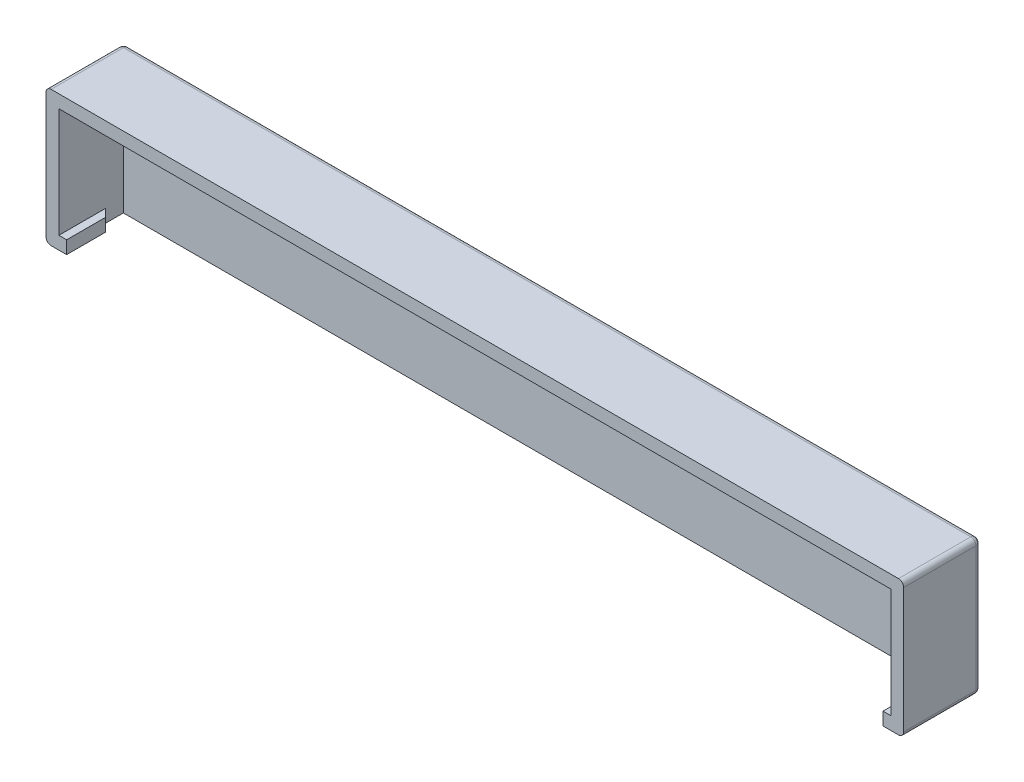
ISO-10303-21;
HEADER;
FILE_DESCRIPTION(('STEP AP214'),'2;1');
FILE_NAME('part.step','',(''),(''),'','','');
FILE_SCHEMA(('AUTOMOTIVE_DESIGN { 1 0 10303 214 1 1 1 1 }'));
ENDSEC;
DATA;
#1=APPLICATION_CONTEXT('core data for automotive mechanical design processes');
#2=APPLICATION_PROTOCOL_DEFINITION('international standard','automotive_design',2000,#1);
#3=PRODUCT_CONTEXT('',#1,'mechanical');
#4=PRODUCT('Part','Part','',(#3));
#5=PRODUCT_RELATED_PRODUCT_CATEGORY('part','',(#4));
#6=PRODUCT_DEFINITION_FORMATION('','',#4);
#7=PRODUCT_DEFINITION_CONTEXT('part definition',#1,'design');
#8=PRODUCT_DEFINITION('design','',#6,#7);
#9=PRODUCT_DEFINITION_SHAPE('','',#8);
#10=(LENGTH_UNIT() NAMED_UNIT(*) SI_UNIT(.MILLI.,.METRE.));
#11=(NAMED_UNIT(*) PLANE_ANGLE_UNIT() SI_UNIT($,.RADIAN.));
#12=(NAMED_UNIT(*) SI_UNIT($,.STERADIAN.) SOLID_ANGLE_UNIT());
#13=UNCERTAINTY_MEASURE_WITH_UNIT(LENGTH_MEASURE(1.E-05),#10,'distance_accuracy_value','');
#14=(GEOMETRIC_REPRESENTATION_CONTEXT(3) GLOBAL_UNCERTAINTY_ASSIGNED_CONTEXT((#13)) GLOBAL_UNIT_ASSIGNED_CONTEXT((#10,
#11,#12)) REPRESENTATION_CONTEXT('',''));
#15=CARTESIAN_POINT('',(0.,0.,0.));
#16=DIRECTION('',(0.,0.,1.));
#17=DIRECTION('',(1.,0.,0.));
#18=AXIS2_PLACEMENT_3D('',#15,#16,#17);
#19=CARTESIAN_POINT('',(0.,0.,3.175));
#20=DIRECTION('',(0.,0.,-1.));
#21=DIRECTION('',(-1.,0.,0.));
#22=AXIS2_PLACEMENT_3D('',#19,#20,#21);
#23=PLANE('',#22);
#24=DIRECTION('',(1.,0.,0.));
#25=VECTOR('',#24,1.);
#26=CARTESIAN_POINT('',(0.,0.,3.175));
#27=LINE('',#26,#25);
#28=CARTESIAN_POINT('',(3.17500000000001,0.,3.175));
#29=VERTEX_POINT('',#28);
#30=CARTESIAN_POINT('',(207.9625,0.,3.175));
#31=VERTEX_POINT('',#30);
#32=EDGE_CURVE('E279',#29,#31,#27,.T.);
#33=ORIENTED_EDGE('',*,*,#32,.T.);
#34=DIRECTION('',(0.,-1.,0.));
#35=VECTOR('',#34,1.);
#36=CARTESIAN_POINT('',(207.9625,3.175,3.175));
#37=LINE('',#36,#35);
#38=CARTESIAN_POINT('',(207.9625,30.1625,3.175));
#39=VERTEX_POINT('',#38);
#40=EDGE_CURVE('E201',#39,#31,#37,.T.);
#41=ORIENTED_EDGE('',*,*,#40,.F.);
#42=DIRECTION('',(1.,0.,0.));
#43=VECTOR('',#42,1.);
#44=CARTESIAN_POINT('',(207.9625,30.1625,3.175));
#45=LINE('',#44,#43);
#46=CARTESIAN_POINT('',(3.175,30.1625,3.175));
#47=VERTEX_POINT('',#46);
#48=EDGE_CURVE('E283',#47,#39,#45,.T.);
#49=ORIENTED_EDGE('',*,*,#48,.F.);
#50=DIRECTION('',(0.,1.,0.));
#51=VECTOR('',#50,1.);
#52=CARTESIAN_POINT('',(3.175,30.1625,3.175));
#53=LINE('',#52,#51);
#54=EDGE_CURVE('E219',#29,#47,#53,.T.);
#55=ORIENTED_EDGE('',*,*,#54,.F.);
#56=EDGE_LOOP('',(#33,#41,#49,#55));
#57=FACE_BOUND('',#56,.T.);
#58=ADVANCED_FACE('F47',(#57),#23,.F.);
#59=CARTESIAN_POINT('',(0.,0.,3.175));
#60=DIRECTION('',(-1.,0.,0.));
#61=DIRECTION('',(0.,0.,1.));
#62=AXIS2_PLACEMENT_3D('',#59,#60,#61);
#63=PLANE('',#62);
#64=DIRECTION('',(0.,1.,0.));
#65=VECTOR('',#64,1.);
#66=CARTESIAN_POINT('',(0.,0.,1.27));
#67=LINE('',#66,#65);
#68=CARTESIAN_POINT('',(0.,32.0675,1.27));
#69=VERTEX_POINT('',#68);
#70=CARTESIAN_POINT('',(0.,1.27,1.27));
#71=VERTEX_POINT('',#70);
#72=EDGE_CURVE('E347',#69,#71,#67,.F.);
#73=ORIENTED_EDGE('',*,*,#72,.T.);
#74=DIRECTION('',(0.,0.,-1.));
#75=VECTOR('',#74,1.);
#76=CARTESIAN_POINT('',(0.,1.27,19.05));
#77=LINE('',#76,#75);
#78=CARTESIAN_POINT('',(0.,1.27,19.05));
#79=VERTEX_POINT('',#78);
#80=EDGE_CURVE('E350',#71,#79,#77,.F.);
#81=ORIENTED_EDGE('',*,*,#80,.T.);
#82=DIRECTION('',(0.,1.,0.));
#83=VECTOR('',#82,1.);
#84=CARTESIAN_POINT('',(0.,33.3375,19.05));
#85=LINE('',#84,#83);
#86=CARTESIAN_POINT('',(0.,32.0675,19.05));
#87=VERTEX_POINT('',#86);
#88=EDGE_CURVE('E271',#79,#87,#85,.T.);
#89=ORIENTED_EDGE('',*,*,#88,.T.);
#90=DIRECTION('',(0.,0.,-1.));
#91=VECTOR('',#90,1.);
#92=CARTESIAN_POINT('',(0.,32.0675,3.175));
#93=LINE('',#92,#91);
#94=EDGE_CURVE('E344',#87,#69,#93,.T.);
#95=ORIENTED_EDGE('',*,*,#94,.T.);
#96=EDGE_LOOP('',(#73,#81,#89,#95));
#97=FACE_BOUND('',#96,.T.);
#98=ADVANCED_FACE('F436',(#97),#63,.T.);
#99=CARTESIAN_POINT('',(0.,0.,3.175));
#100=DIRECTION('',(0.,1.,0.));
#101=DIRECTION('',(0.,0.,1.));
#102=AXIS2_PLACEMENT_3D('',#99,#100,#101);
#103=PLANE('',#102);
#104=DIRECTION('',(-1.,0.,0.));
#105=VECTOR('',#104,1.);
#106=CARTESIAN_POINT('',(0.,0.,19.05));
#107=LINE('',#106,#105);
#108=CARTESIAN_POINT('',(5.08,0.,19.05));
#109=VERTEX_POINT('',#108);
#110=CARTESIAN_POINT('',(1.27,0.,19.05));
#111=VERTEX_POINT('',#110);
#112=EDGE_CURVE('E268',#109,#111,#107,.T.);
#113=ORIENTED_EDGE('',*,*,#112,.T.);
#114=DIRECTION('',(0.,0.,-1.));
#115=VECTOR('',#114,1.);
#116=CARTESIAN_POINT('',(1.27,0.,0.));
#117=LINE('',#116,#115);
#118=CARTESIAN_POINT('',(1.27,0.,1.27));
#119=VERTEX_POINT('',#118);
#120=EDGE_CURVE('E328',#111,#119,#117,.T.);
#121=ORIENTED_EDGE('',*,*,#120,.T.);
#122=DIRECTION('',(1.,0.,0.));
#123=VECTOR('',#122,1.);
#124=CARTESIAN_POINT('',(211.1375,0.,1.27));
#125=LINE('',#124,#123);
#126=CARTESIAN_POINT('',(209.8675,0.,1.27));
#127=VERTEX_POINT('',#126);
#128=EDGE_CURVE('E324',#119,#127,#125,.T.);
#129=ORIENTED_EDGE('',*,*,#128,.T.);
#130=DIRECTION('',(0.,0.,-1.));
#131=VECTOR('',#130,1.);
#132=CARTESIAN_POINT('',(209.8675,0.,3.175));
#133=LINE('',#132,#131);
#134=CARTESIAN_POINT('',(209.8675,0.,19.05));
#135=VERTEX_POINT('',#134);
#136=EDGE_CURVE('E321',#127,#135,#133,.F.);
#137=ORIENTED_EDGE('',*,*,#136,.T.);
#138=DIRECTION('',(-1.,0.,0.));
#139=VECTOR('',#138,1.);
#140=CARTESIAN_POINT('',(206.0575,0.,19.05));
#141=LINE('',#140,#139);
#142=CARTESIAN_POINT('',(206.0575,0.,19.05));
#143=VERTEX_POINT('',#142);
#144=EDGE_CURVE('E236',#135,#143,#141,.T.);
#145=ORIENTED_EDGE('',*,*,#144,.T.);
#146=DIRECTION('',(0.,0.,-1.));
#147=VECTOR('',#146,1.);
#148=CARTESIAN_POINT('',(206.0575,0.,251.853205385323));
#149=LINE('',#148,#147);
#150=CARTESIAN_POINT('',(206.0575,0.,9.525));
#151=VERTEX_POINT('',#150);
#152=EDGE_CURVE('E211',#143,#151,#149,.T.);
#153=ORIENTED_EDGE('',*,*,#152,.T.);
#154=DIRECTION('',(-0.707106781186544,0.,0.707106781186551));
#155=VECTOR('',#154,1.);
#156=CARTESIAN_POINT('',(206.0575,0.,9.525));
#157=LINE('',#156,#155);
#158=CARTESIAN_POINT('',(207.9625,0.,7.61999999999999));
#159=VERTEX_POINT('',#158);
#160=EDGE_CURVE('E186',#159,#151,#157,.T.);
#161=ORIENTED_EDGE('',*,*,#160,.F.);
#162=DIRECTION('',(0.,0.,1.));
#163=VECTOR('',#162,1.);
#164=CARTESIAN_POINT('',(207.9625,0.,7.61999999999999));
#165=LINE('',#164,#163);
#166=EDGE_CURVE('E198',#31,#159,#165,.T.);
#167=ORIENTED_EDGE('',*,*,#166,.F.);
#168=ORIENTED_EDGE('',*,*,#32,.F.);
#169=DIRECTION('',(0.,0.,-1.));
#170=VECTOR('',#169,1.);
#171=CARTESIAN_POINT('',(3.17500000000001,0.,7.61999999999996));
#172=LINE('',#171,#170);
#173=CARTESIAN_POINT('',(3.17500000000001,0.,7.61999999999996));
#174=VERTEX_POINT('',#173);
#175=EDGE_CURVE('E226',#174,#29,#172,.T.);
#176=ORIENTED_EDGE('',*,*,#175,.F.);
#177=DIRECTION('',(-0.707106781186544,0.,-0.707106781186551));
#178=VECTOR('',#177,1.);
#179=CARTESIAN_POINT('',(5.08,0.,9.52499999999997));
#180=LINE('',#179,#178);
#181=CARTESIAN_POINT('',(5.08,0.,9.52499999999997));
#182=VERTEX_POINT('',#181);
#183=EDGE_CURVE('E227',#182,#174,#180,.T.);
#184=ORIENTED_EDGE('',*,*,#183,.F.);
#185=DIRECTION('',(0.,0.,-1.));
#186=VECTOR('',#185,1.);
#187=CARTESIAN_POINT('',(5.08,0.,251.853205385323));
#188=LINE('',#187,#186);
#189=EDGE_CURVE('E313',#109,#182,#188,.T.);
#190=ORIENTED_EDGE('',*,*,#189,.F.);
#191=EDGE_LOOP('',(#113,#121,#129,#137,#145,#153,#161,#167,#168,#176,#184,#190));
#192=FACE_BOUND('',#191,.T.);
#193=ADVANCED_FACE('F209',(#192),#103,.F.);
#194=CARTESIAN_POINT('',(211.1375,0.,3.175));
#195=DIRECTION('',(-1.,0.,0.));
#196=DIRECTION('',(0.,0.,1.));
#197=AXIS2_PLACEMENT_3D('',#194,#195,#196);
#198=PLANE('',#197);
#199=DIRECTION('',(0.,-1.,0.));
#200=VECTOR('',#199,1.);
#201=CARTESIAN_POINT('',(211.1375,0.,19.05));
#202=LINE('',#201,#200);
#203=CARTESIAN_POINT('',(211.1375,32.0675,19.05));
#204=VERTEX_POINT('',#203);
#205=CARTESIAN_POINT('',(211.1375,1.27,19.05));
#206=VERTEX_POINT('',#205);
#207=EDGE_CURVE('E240',#204,#206,#202,.T.);
#208=ORIENTED_EDGE('',*,*,#207,.T.);
#209=DIRECTION('',(0.,0.,-1.));
#210=VECTOR('',#209,1.);
#211=CARTESIAN_POINT('',(211.1375,1.27,3.175));
#212=LINE('',#211,#210);
#213=CARTESIAN_POINT('',(211.1375,1.27,1.27));
#214=VERTEX_POINT('',#213);
#215=EDGE_CURVE('E12',#206,#214,#212,.T.);
#216=ORIENTED_EDGE('',*,*,#215,.T.);
#217=DIRECTION('',(0.,1.,0.));
#218=VECTOR('',#217,1.);
#219=CARTESIAN_POINT('',(211.1375,33.3375,1.27));
#220=LINE('',#219,#218);
#221=CARTESIAN_POINT('',(211.1375,32.0675,1.27));
#222=VERTEX_POINT('',#221);
#223=EDGE_CURVE('E57',#214,#222,#220,.T.);
#224=ORIENTED_EDGE('',*,*,#223,.T.);
#225=DIRECTION('',(0.,0.,-1.));
#226=VECTOR('',#225,1.);
#227=CARTESIAN_POINT('',(211.1375,32.0675,19.05));
#228=LINE('',#227,#226);
#229=EDGE_CURVE('E374',#222,#204,#228,.F.);
#230=ORIENTED_EDGE('',*,*,#229,.T.);
#231=EDGE_LOOP('',(#208,#216,#224,#230));
#232=FACE_BOUND('',#231,.T.);
#233=ADVANCED_FACE('F500',(#232),#198,.F.);
#234=CARTESIAN_POINT('',(0.,33.3375,3.175));
#235=DIRECTION('',(0.,1.,0.));
#236=DIRECTION('',(0.,0.,1.));
#237=AXIS2_PLACEMENT_3D('',#234,#235,#236);
#238=PLANE('',#237);
#239=DIRECTION('',(1.,0.,0.));
#240=VECTOR('',#239,1.);
#241=CARTESIAN_POINT('',(0.,33.3375,1.27));
#242=LINE('',#241,#240);
#243=CARTESIAN_POINT('',(209.8675,33.3375,1.27));
#244=VERTEX_POINT('',#243);
#245=CARTESIAN_POINT('',(1.27,33.3375,1.27));
#246=VERTEX_POINT('',#245);
#247=EDGE_CURVE('E368',#244,#246,#242,.F.);
#248=ORIENTED_EDGE('',*,*,#247,.T.);
#249=DIRECTION('',(0.,0.,-1.));
#250=VECTOR('',#249,1.);
#251=CARTESIAN_POINT('',(1.27,33.3375,3.175));
#252=LINE('',#251,#250);
#253=CARTESIAN_POINT('',(1.26999999999999,33.3375,19.05));
#254=VERTEX_POINT('',#253);
#255=EDGE_CURVE('E371',#246,#254,#252,.F.);
#256=ORIENTED_EDGE('',*,*,#255,.T.);
#257=DIRECTION('',(1.,0.,0.));
#258=VECTOR('',#257,1.);
#259=CARTESIAN_POINT('',(211.1375,33.3375,19.05));
#260=LINE('',#259,#258);
#261=CARTESIAN_POINT('',(209.8675,33.3375,19.05));
#262=VERTEX_POINT('',#261);
#263=EDGE_CURVE('E275',#254,#262,#260,.T.);
#264=ORIENTED_EDGE('',*,*,#263,.T.);
#265=DIRECTION('',(0.,0.,-1.));
#266=VECTOR('',#265,1.);
#267=CARTESIAN_POINT('',(209.8675,33.3375,0.));
#268=LINE('',#267,#266);
#269=EDGE_CURVE('E365',#262,#244,#268,.T.);
#270=ORIENTED_EDGE('',*,*,#269,.T.);
#271=EDGE_LOOP('',(#248,#256,#264,#270));
#272=FACE_BOUND('',#271,.T.);
#273=ADVANCED_FACE('F504',(#272),#238,.T.);
#274=CARTESIAN_POINT('',(0.,0.,0.));
#275=DIRECTION('',(0.,0.,-1.));
#276=DIRECTION('',(-1.,0.,0.));
#277=AXIS2_PLACEMENT_3D('',#274,#275,#276);
#278=PLANE('',#277);
#279=DIRECTION('',(0.,1.,0.));
#280=VECTOR('',#279,1.);
#281=CARTESIAN_POINT('',(209.8675,0.,0.));
#282=LINE('',#281,#280);
#283=CARTESIAN_POINT('',(209.8675,32.0675,0.));
#284=VERTEX_POINT('',#283);
#285=CARTESIAN_POINT('',(209.8675,1.27,0.));
#286=VERTEX_POINT('',#285);
#287=EDGE_CURVE('E331',#284,#286,#282,.F.);
#288=ORIENTED_EDGE('',*,*,#287,.T.);
#289=DIRECTION('',(1.,0.,0.));
#290=VECTOR('',#289,1.);
#291=CARTESIAN_POINT('',(0.,1.27,0.));
#292=LINE('',#291,#290);
#293=CARTESIAN_POINT('',(1.27,1.27,0.));
#294=VERTEX_POINT('',#293);
#295=EDGE_CURVE('E340',#286,#294,#292,.F.);
#296=ORIENTED_EDGE('',*,*,#295,.T.);
#297=DIRECTION('',(0.,1.,0.));
#298=VECTOR('',#297,1.);
#299=CARTESIAN_POINT('',(1.27,0.,0.));
#300=LINE('',#299,#298);
#301=CARTESIAN_POINT('',(1.27,32.0675,0.));
#302=VERTEX_POINT('',#301);
#303=EDGE_CURVE('E337',#294,#302,#300,.T.);
#304=ORIENTED_EDGE('',*,*,#303,.T.);
#305=DIRECTION('',(1.,0.,0.));
#306=VECTOR('',#305,1.);
#307=CARTESIAN_POINT('',(0.,32.0675,0.));
#308=LINE('',#307,#306);
#309=EDGE_CURVE('E334',#302,#284,#308,.T.);
#310=ORIENTED_EDGE('',*,*,#309,.T.);
#311=EDGE_LOOP('',(#288,#296,#304,#310));
#312=FACE_BOUND('',#311,.T.);
#313=ADVANCED_FACE('F489',(#312),#278,.T.);
#314=CARTESIAN_POINT('',(206.0575,0.,251.853205385323));
#315=DIRECTION('',(1.,0.,0.));
#316=DIRECTION('',(0.,0.,-1.));
#317=AXIS2_PLACEMENT_3D('',#314,#315,#316);
#318=PLANE('',#317);
#319=DIRECTION('',(0.,0.,-1.));
#320=VECTOR('',#319,1.);
#321=CARTESIAN_POINT('',(206.0575,3.175,251.853205385323));
#322=LINE('',#321,#320);
#323=CARTESIAN_POINT('',(206.0575,3.175,19.05));
#324=VERTEX_POINT('',#323);
#325=CARTESIAN_POINT('',(206.0575,3.175,9.525));
#326=VERTEX_POINT('',#325);
#327=EDGE_CURVE('E291',#324,#326,#322,.T.);
#328=ORIENTED_EDGE('',*,*,#327,.T.);
#329=DIRECTION('',(0.,-1.,0.));
#330=VECTOR('',#329,1.);
#331=CARTESIAN_POINT('',(206.0575,33.3385,9.525));
#332=LINE('',#331,#330);
#333=EDGE_CURVE('E194',#326,#151,#332,.T.);
#334=ORIENTED_EDGE('',*,*,#333,.T.);
#335=ORIENTED_EDGE('',*,*,#152,.F.);
#336=DIRECTION('',(0.,1.,0.));
#337=VECTOR('',#336,1.);
#338=CARTESIAN_POINT('',(206.0575,0.,19.05));
#339=LINE('',#338,#337);
#340=EDGE_CURVE('E239',#143,#324,#339,.T.);
#341=ORIENTED_EDGE('',*,*,#340,.T.);
#342=EDGE_LOOP('',(#328,#334,#335,#341));
#343=FACE_BOUND('',#342,.T.);
#344=ADVANCED_FACE('F469',(#343),#318,.F.);
#345=CARTESIAN_POINT('',(206.0575,3.175,251.853205385323));
#346=DIRECTION('',(0.,-1.,0.));
#347=DIRECTION('',(1.,0.,0.));
#348=AXIS2_PLACEMENT_3D('',#345,#346,#347);
#349=PLANE('',#348);
#350=DIRECTION('',(0.,0.,-1.));
#351=VECTOR('',#350,1.);
#352=CARTESIAN_POINT('',(207.9625,3.175,251.853205385323));
#353=LINE('',#352,#351);
#354=CARTESIAN_POINT('',(207.9625,3.175,19.05));
#355=VERTEX_POINT('',#354);
#356=CARTESIAN_POINT('',(207.9625,3.175,7.62000000000004));
#357=VERTEX_POINT('',#356);
#358=EDGE_CURVE('E295',#355,#357,#353,.T.);
#359=ORIENTED_EDGE('',*,*,#358,.T.);
#360=DIRECTION('',(0.707106781186544,0.,-0.707106781186551));
#361=VECTOR('',#360,1.);
#362=CARTESIAN_POINT('',(206.0575,3.175,9.525));
#363=LINE('',#362,#361);
#364=EDGE_CURVE('E189',#326,#357,#363,.T.);
#365=ORIENTED_EDGE('',*,*,#364,.F.);
#366=ORIENTED_EDGE('',*,*,#327,.F.);
#367=DIRECTION('',(1.,0.,0.));
#368=VECTOR('',#367,1.);
#369=CARTESIAN_POINT('',(206.0575,3.175,19.05));
#370=LINE('',#369,#368);
#371=EDGE_CURVE('E244',#324,#355,#370,.T.);
#372=ORIENTED_EDGE('',*,*,#371,.T.);
#373=EDGE_LOOP('',(#359,#365,#366,#372));
#374=FACE_BOUND('',#373,.T.);
#375=ADVANCED_FACE('F467',(#374),#349,.F.);
#376=CARTESIAN_POINT('',(207.9625,3.175,251.853205385323));
#377=DIRECTION('',(1.,0.,0.));
#378=DIRECTION('',(0.,0.,-1.));
#379=AXIS2_PLACEMENT_3D('',#376,#377,#378);
#380=PLANE('',#379);
#381=ORIENTED_EDGE('',*,*,#358,.F.);
#382=DIRECTION('',(0.,1.,0.));
#383=VECTOR('',#382,1.);
#384=CARTESIAN_POINT('',(207.9625,3.175,19.05));
#385=LINE('',#384,#383);
#386=CARTESIAN_POINT('',(207.9625,30.1625,19.05));
#387=VERTEX_POINT('',#386);
#388=EDGE_CURVE('E248',#355,#387,#385,.T.);
#389=ORIENTED_EDGE('',*,*,#388,.T.);
#390=DIRECTION('',(0.,0.,-1.));
#391=VECTOR('',#390,1.);
#392=CARTESIAN_POINT('',(207.9625,30.1625,251.853205385323));
#393=LINE('',#392,#391);
#394=EDGE_CURVE('E298',#387,#39,#393,.T.);
#395=ORIENTED_EDGE('',*,*,#394,.T.);
#396=ORIENTED_EDGE('',*,*,#40,.T.);
#397=ORIENTED_EDGE('',*,*,#166,.T.);
#398=DIRECTION('',(0.,-1.,0.));
#399=VECTOR('',#398,1.);
#400=CARTESIAN_POINT('',(207.9625,33.3385,7.61999999999999));
#401=LINE('',#400,#399);
#402=EDGE_CURVE('E182',#357,#159,#401,.T.);
#403=ORIENTED_EDGE('',*,*,#402,.F.);
#404=EDGE_LOOP('',(#381,#389,#395,#396,#397,#403));
#405=FACE_BOUND('',#404,.T.);
#406=ADVANCED_FACE('F199',(#405),#380,.F.);
#407=CARTESIAN_POINT('',(207.9625,30.1625,251.853205385323));
#408=DIRECTION('',(0.,1.,0.));
#409=DIRECTION('',(0.,0.,1.));
#410=AXIS2_PLACEMENT_3D('',#407,#408,#409);
#411=PLANE('',#410);
#412=ORIENTED_EDGE('',*,*,#394,.F.);
#413=DIRECTION('',(-1.,0.,0.));
#414=VECTOR('',#413,1.);
#415=CARTESIAN_POINT('',(207.9625,30.1625,19.05));
#416=LINE('',#415,#414);
#417=CARTESIAN_POINT('',(3.17500000000001,30.1625,19.05));
#418=VERTEX_POINT('',#417);
#419=EDGE_CURVE('E252',#387,#418,#416,.T.);
#420=ORIENTED_EDGE('',*,*,#419,.T.);
#421=DIRECTION('',(0.,0.,-1.));
#422=VECTOR('',#421,1.);
#423=CARTESIAN_POINT('',(3.175,30.1625,251.853205385323));
#424=LINE('',#423,#422);
#425=EDGE_CURVE('E301',#418,#47,#424,.T.);
#426=ORIENTED_EDGE('',*,*,#425,.T.);
#427=ORIENTED_EDGE('',*,*,#48,.T.);
#428=EDGE_LOOP('',(#412,#420,#426,#427));
#429=FACE_BOUND('',#428,.T.);
#430=ADVANCED_FACE('F463',(#429),#411,.F.);
#431=CARTESIAN_POINT('',(3.175,30.1625,251.853205385323));
#432=DIRECTION('',(-1.,0.,0.));
#433=DIRECTION('',(0.,0.,1.));
#434=AXIS2_PLACEMENT_3D('',#431,#432,#433);
#435=PLANE('',#434);
#436=ORIENTED_EDGE('',*,*,#425,.F.);
#437=DIRECTION('',(0.,-1.,0.));
#438=VECTOR('',#437,1.);
#439=CARTESIAN_POINT('',(3.175,30.1625,19.05));
#440=LINE('',#439,#438);
#441=CARTESIAN_POINT('',(3.175,3.175,19.05));
#442=VERTEX_POINT('',#441);
#443=EDGE_CURVE('E256',#418,#442,#440,.T.);
#444=ORIENTED_EDGE('',*,*,#443,.T.);
#445=DIRECTION('',(0.,0.,-1.));
#446=VECTOR('',#445,1.);
#447=CARTESIAN_POINT('',(3.175,3.175,251.853205385323));
#448=LINE('',#447,#446);
#449=CARTESIAN_POINT('',(3.17500000000001,3.17499999999999,7.61999999999996));
#450=VERTEX_POINT('',#449);
#451=EDGE_CURVE('E305',#442,#450,#448,.T.);
#452=ORIENTED_EDGE('',*,*,#451,.T.);
#453=DIRECTION('',(0.,-1.,0.));
#454=VECTOR('',#453,1.);
#455=CARTESIAN_POINT('',(3.17500000000001,33.3385,7.61999999999996));
#456=LINE('',#455,#454);
#457=EDGE_CURVE('E223',#450,#174,#456,.T.);
#458=ORIENTED_EDGE('',*,*,#457,.T.);
#459=ORIENTED_EDGE('',*,*,#175,.T.);
#460=ORIENTED_EDGE('',*,*,#54,.T.);
#461=EDGE_LOOP('',(#436,#444,#452,#458,#459,#460));
#462=FACE_BOUND('',#461,.T.);
#463=ADVANCED_FACE('F460',(#462),#435,.F.);
#464=CARTESIAN_POINT('',(3.175,3.175,251.853205385323));
#465=DIRECTION('',(0.,-1.,0.));
#466=DIRECTION('',(1.,0.,0.));
#467=AXIS2_PLACEMENT_3D('',#464,#465,#466);
#468=PLANE('',#467);
#469=DIRECTION('',(0.,0.,-1.));
#470=VECTOR('',#469,1.);
#471=CARTESIAN_POINT('',(5.08,3.17499999999999,251.853205385323));
#472=LINE('',#471,#470);
#473=CARTESIAN_POINT('',(5.08,3.17499999999999,19.05));
#474=VERTEX_POINT('',#473);
#475=CARTESIAN_POINT('',(5.08,3.17499999999999,9.52500000000003));
#476=VERTEX_POINT('',#475);
#477=EDGE_CURVE('E309',#474,#476,#472,.T.);
#478=ORIENTED_EDGE('',*,*,#477,.T.);
#479=DIRECTION('',(0.707106781186544,0.,0.707106781186551));
#480=VECTOR('',#479,1.);
#481=CARTESIAN_POINT('',(5.07999999999991,3.17499999999999,9.52499999999988));
#482=LINE('',#481,#480);
#483=EDGE_CURVE('E205',#450,#476,#482,.T.);
#484=ORIENTED_EDGE('',*,*,#483,.F.);
#485=ORIENTED_EDGE('',*,*,#451,.F.);
#486=DIRECTION('',(1.,0.,0.));
#487=VECTOR('',#486,1.);
#488=CARTESIAN_POINT('',(3.175,3.175,19.05));
#489=LINE('',#488,#487);
#490=EDGE_CURVE('E260',#442,#474,#489,.T.);
#491=ORIENTED_EDGE('',*,*,#490,.T.);
#492=EDGE_LOOP('',(#478,#484,#485,#491));
#493=FACE_BOUND('',#492,.T.);
#494=ADVANCED_FACE('F458',(#493),#468,.F.);
#495=CARTESIAN_POINT('',(5.08,0.,251.853205385323));
#496=DIRECTION('',(-1.,0.,0.));
#497=DIRECTION('',(0.,-1.,0.));
#498=AXIS2_PLACEMENT_3D('',#495,#496,#497);
#499=PLANE('',#498);
#500=ORIENTED_EDGE('',*,*,#189,.T.);
#501=DIRECTION('',(0.,-1.,0.));
#502=VECTOR('',#501,1.);
#503=CARTESIAN_POINT('',(5.08,33.3385,9.52499999999997));
#504=LINE('',#503,#502);
#505=EDGE_CURVE('E220',#476,#182,#504,.T.);
#506=ORIENTED_EDGE('',*,*,#505,.F.);
#507=ORIENTED_EDGE('',*,*,#477,.F.);
#508=DIRECTION('',(0.,-1.,0.));
#509=VECTOR('',#508,1.);
#510=CARTESIAN_POINT('',(5.08,0.,19.05));
#511=LINE('',#510,#509);
#512=EDGE_CURVE('E264',#474,#109,#511,.T.);
#513=ORIENTED_EDGE('',*,*,#512,.T.);
#514=EDGE_LOOP('',(#500,#506,#507,#513));
#515=FACE_BOUND('',#514,.T.);
#516=ADVANCED_FACE('F453',(#515),#499,.F.);
#517=CARTESIAN_POINT('',(0.,0.,19.05));
#518=DIRECTION('',(0.,0.,-1.));
#519=DIRECTION('',(-1.,0.,0.));
#520=AXIS2_PLACEMENT_3D('',#517,#518,#519);
#521=PLANE('',#520);
#522=ORIENTED_EDGE('',*,*,#88,.F.);
#523=CARTESIAN_POINT('',(1.27,1.27,19.05));
#524=DIRECTION('',(0.,0.,-1.));
#525=DIRECTION('',(-1.,0.,0.));
#526=AXIS2_PLACEMENT_3D('',#523,#524,#525);
#527=CIRCLE('',#526,1.27);
#528=EDGE_CURVE('E362',#79,#111,#527,.F.);
#529=ORIENTED_EDGE('',*,*,#528,.T.);
#530=ORIENTED_EDGE('',*,*,#112,.F.);
#531=ORIENTED_EDGE('',*,*,#512,.F.);
#532=ORIENTED_EDGE('',*,*,#490,.F.);
#533=ORIENTED_EDGE('',*,*,#443,.F.);
#534=ORIENTED_EDGE('',*,*,#419,.F.);
#535=ORIENTED_EDGE('',*,*,#388,.F.);
#536=ORIENTED_EDGE('',*,*,#371,.F.);
#537=ORIENTED_EDGE('',*,*,#340,.F.);
#538=ORIENTED_EDGE('',*,*,#144,.F.);
#539=CARTESIAN_POINT('',(209.8675,1.27,19.05));
#540=DIRECTION('',(0.,0.,-1.));
#541=DIRECTION('',(-1.,0.,0.));
#542=AXIS2_PLACEMENT_3D('',#539,#540,#541);
#543=CIRCLE('',#542,1.27);
#544=EDGE_CURVE('E356',#135,#206,#543,.F.);
#545=ORIENTED_EDGE('',*,*,#544,.T.);
#546=ORIENTED_EDGE('',*,*,#207,.F.);
#547=CARTESIAN_POINT('',(209.8675,32.0675,19.05));
#548=DIRECTION('',(0.,0.,-1.));
#549=DIRECTION('',(-1.,0.,0.));
#550=AXIS2_PLACEMENT_3D('',#547,#548,#549);
#551=CIRCLE('',#550,1.27);
#552=EDGE_CURVE('E353',#204,#262,#551,.F.);
#553=ORIENTED_EDGE('',*,*,#552,.T.);
#554=ORIENTED_EDGE('',*,*,#263,.F.);
#555=CARTESIAN_POINT('',(1.27,32.0675,19.05));
#556=DIRECTION('',(0.,0.,-1.));
#557=DIRECTION('',(-1.,0.,0.));
#558=AXIS2_PLACEMENT_3D('',#555,#556,#557);
#559=CIRCLE('',#558,1.27);
#560=EDGE_CURVE('E359',#254,#87,#559,.F.);
#561=ORIENTED_EDGE('',*,*,#560,.T.);
#562=EDGE_LOOP('',(#522,#529,#530,#531,#532,#533,#534,#535,#536,#537,#538,#545,#546,#553,#554,#561));
#563=FACE_BOUND('',#562,.T.);
#564=ADVANCED_FACE('F446',(#563),#521,.F.);
#565=CARTESIAN_POINT('',(5.08,33.3385,9.52499999999997));
#566=DIRECTION('',(-0.707106781186551,0.,0.707106781186544));
#567=DIRECTION('',(0.707106781186544,0.,0.707106781186551));
#568=AXIS2_PLACEMENT_3D('',#565,#566,#567);
#569=PLANE('',#568);
#570=ORIENTED_EDGE('',*,*,#483,.T.);
#571=ORIENTED_EDGE('',*,*,#505,.T.);
#572=ORIENTED_EDGE('',*,*,#183,.T.);
#573=ORIENTED_EDGE('',*,*,#457,.F.);
#574=EDGE_LOOP('',(#570,#571,#572,#573));
#575=FACE_BOUND('',#574,.T.);
#576=ADVANCED_FACE('F513',(#575),#569,.F.);
#577=CARTESIAN_POINT('',(206.0575,33.3385,9.525));
#578=DIRECTION('',(0.707106781186551,0.,0.707106781186544));
#579=DIRECTION('',(0.707106781186544,0.,-0.707106781186551));
#580=AXIS2_PLACEMENT_3D('',#577,#578,#579);
#581=PLANE('',#580);
#582=ORIENTED_EDGE('',*,*,#364,.T.);
#583=ORIENTED_EDGE('',*,*,#402,.T.);
#584=ORIENTED_EDGE('',*,*,#160,.T.);
#585=ORIENTED_EDGE('',*,*,#333,.F.);
#586=EDGE_LOOP('',(#582,#583,#584,#585));
#587=FACE_BOUND('',#586,.T.);
#588=ADVANCED_FACE('F184',(#587),#581,.F.);
#589=CARTESIAN_POINT('',(1.27,32.0675,3.175));
#590=DIRECTION('',(0.,0.,-1.));
#591=DIRECTION('',(-1.,0.,0.));
#592=AXIS2_PLACEMENT_3D('',#589,#590,#591);
#593=CYLINDRICAL_SURFACE('',#592,1.27);
#594=ORIENTED_EDGE('',*,*,#560,.F.);
#595=ORIENTED_EDGE('',*,*,#255,.F.);
#596=CARTESIAN_POINT('',(1.27,32.0675,1.27));
#597=DIRECTION('',(0.,0.,-1.));
#598=DIRECTION('',(-1.,0.,0.));
#599=AXIS2_PLACEMENT_3D('',#596,#597,#598);
#600=CIRCLE('',#599,1.27);
#601=EDGE_CURVE('E416',#69,#246,#600,.T.);
#602=ORIENTED_EDGE('',*,*,#601,.F.);
#603=ORIENTED_EDGE('',*,*,#94,.F.);
#604=EDGE_LOOP('',(#594,#595,#602,#603));
#605=FACE_BOUND('',#604,.T.);
#606=ADVANCED_FACE('F49',(#605),#593,.T.);
#607=CARTESIAN_POINT('',(209.8675,32.0675,3.175));
#608=DIRECTION('',(0.,0.,1.));
#609=DIRECTION('',(1.,0.,0.));
#610=AXIS2_PLACEMENT_3D('',#607,#608,#609);
#611=CYLINDRICAL_SURFACE('',#610,1.27);
#612=ORIENTED_EDGE('',*,*,#552,.F.);
#613=ORIENTED_EDGE('',*,*,#229,.F.);
#614=CARTESIAN_POINT('',(209.8675,32.0675,1.27));
#615=DIRECTION('',(0.,0.,-1.));
#616=DIRECTION('',(-1.,0.,0.));
#617=AXIS2_PLACEMENT_3D('',#614,#615,#616);
#618=CIRCLE('',#617,1.27);
#619=EDGE_CURVE('E413',#244,#222,#618,.T.);
#620=ORIENTED_EDGE('',*,*,#619,.F.);
#621=ORIENTED_EDGE('',*,*,#269,.F.);
#622=EDGE_LOOP('',(#612,#613,#620,#621));
#623=FACE_BOUND('',#622,.T.);
#624=ADVANCED_FACE('F499',(#623),#611,.T.);
#625=CARTESIAN_POINT('',(0.,32.0675,1.27));
#626=DIRECTION('',(1.,0.,0.));
#627=DIRECTION('',(0.,0.,-1.));
#628=AXIS2_PLACEMENT_3D('',#625,#626,#627);
#629=CYLINDRICAL_SURFACE('',#628,1.27);
#630=CARTESIAN_POINT('',(1.27,32.0675,1.27));
#631=DIRECTION('',(-1.,0.,0.));
#632=DIRECTION('',(0.,0.,1.));
#633=AXIS2_PLACEMENT_3D('',#630,#631,#632);
#634=CIRCLE('',#633,1.27);
#635=EDGE_CURVE('E51',#246,#302,#634,.T.);
#636=ORIENTED_EDGE('',*,*,#635,.F.);
#637=ORIENTED_EDGE('',*,*,#247,.F.);
#638=CARTESIAN_POINT('',(209.8675,32.0675,1.27));
#639=DIRECTION('',(1.,0.,0.));
#640=DIRECTION('',(0.,0.,-1.));
#641=AXIS2_PLACEMENT_3D('',#638,#639,#640);
#642=CIRCLE('',#641,1.27);
#643=EDGE_CURVE('E409',#284,#244,#642,.T.);
#644=ORIENTED_EDGE('',*,*,#643,.F.);
#645=ORIENTED_EDGE('',*,*,#309,.F.);
#646=EDGE_LOOP('',(#636,#637,#644,#645));
#647=FACE_BOUND('',#646,.T.);
#648=ADVANCED_FACE('F492',(#647),#629,.T.);
#649=CARTESIAN_POINT('',(1.27,32.0675,1.27));
#650=DIRECTION('',(0.,1.,0.));
#651=DIRECTION('',(0.,0.,1.));
#652=AXIS2_PLACEMENT_3D('',#649,#650,#651);
#653=SPHERICAL_SURFACE('',#652,1.27);
#654=ORIENTED_EDGE('',*,*,#601,.T.);
#655=ORIENTED_EDGE('',*,*,#635,.T.);
#656=CARTESIAN_POINT('',(1.27,32.0675,1.27));
#657=DIRECTION('',(0.,1.,0.));
#658=DIRECTION('',(0.,0.,1.));
#659=AXIS2_PLACEMENT_3D('',#656,#657,#658);
#660=CIRCLE('',#659,1.27);
#661=EDGE_CURVE('E405',#69,#302,#660,.F.);
#662=ORIENTED_EDGE('',*,*,#661,.F.);
#663=EDGE_LOOP('',(#654,#655,#662));
#664=FACE_BOUND('',#663,.T.);
#665=ADVANCED_FACE('F425',(#664),#653,.T.);
#666=CARTESIAN_POINT('',(209.8675,32.0675,1.27));
#667=DIRECTION('',(0.,1.,0.));
#668=DIRECTION('',(0.,0.,1.));
#669=AXIS2_PLACEMENT_3D('',#666,#667,#668);
#670=SPHERICAL_SURFACE('',#669,1.27);
#671=ORIENTED_EDGE('',*,*,#643,.T.);
#672=ORIENTED_EDGE('',*,*,#619,.T.);
#673=CARTESIAN_POINT('',(209.8675,32.0675,1.27));
#674=DIRECTION('',(0.,1.,0.));
#675=DIRECTION('',(0.,0.,1.));
#676=AXIS2_PLACEMENT_3D('',#673,#674,#675);
#677=CIRCLE('',#676,1.27);
#678=EDGE_CURVE('E401',#284,#222,#677,.F.);
#679=ORIENTED_EDGE('',*,*,#678,.F.);
#680=EDGE_LOOP('',(#671,#672,#679));
#681=FACE_BOUND('',#680,.T.);
#682=ADVANCED_FACE('F495',(#681),#670,.T.);
#683=CARTESIAN_POINT('',(1.27,0.,1.27));
#684=DIRECTION('',(0.,1.,0.));
#685=DIRECTION('',(0.,0.,1.));
#686=AXIS2_PLACEMENT_3D('',#683,#684,#685);
#687=CYLINDRICAL_SURFACE('',#686,1.27);
#688=ORIENTED_EDGE('',*,*,#661,.T.);
#689=ORIENTED_EDGE('',*,*,#303,.F.);
#690=CARTESIAN_POINT('',(1.27,1.27,1.27));
#691=DIRECTION('',(0.,-1.,0.));
#692=DIRECTION('',(0.,0.,-1.));
#693=AXIS2_PLACEMENT_3D('',#690,#691,#692);
#694=CIRCLE('',#693,1.27);
#695=EDGE_CURVE('E397',#71,#294,#694,.T.);
#696=ORIENTED_EDGE('',*,*,#695,.F.);
#697=ORIENTED_EDGE('',*,*,#72,.F.);
#698=EDGE_LOOP('',(#688,#689,#696,#697));
#699=FACE_BOUND('',#698,.T.);
#700=ADVANCED_FACE('F432',(#699),#687,.T.);
#701=CARTESIAN_POINT('',(1.27,1.27,3.175));
#702=DIRECTION('',(0.,0.,1.));
#703=DIRECTION('',(1.,0.,0.));
#704=AXIS2_PLACEMENT_3D('',#701,#702,#703);
#705=CYLINDRICAL_SURFACE('',#704,1.27);
#706=ORIENTED_EDGE('',*,*,#528,.F.);
#707=ORIENTED_EDGE('',*,*,#80,.F.);
#708=CARTESIAN_POINT('',(1.27,1.27,1.27));
#709=DIRECTION('',(0.,0.,-1.));
#710=DIRECTION('',(-1.,0.,0.));
#711=AXIS2_PLACEMENT_3D('',#708,#709,#710);
#712=CIRCLE('',#711,1.27);
#713=EDGE_CURVE('E393',#119,#71,#712,.T.);
#714=ORIENTED_EDGE('',*,*,#713,.F.);
#715=ORIENTED_EDGE('',*,*,#120,.F.);
#716=EDGE_LOOP('',(#706,#707,#714,#715));
#717=FACE_BOUND('',#716,.T.);
#718=ADVANCED_FACE('F442',(#717),#705,.T.);
#719=CARTESIAN_POINT('',(209.8675,1.27,3.175));
#720=DIRECTION('',(0.,0.,-1.));
#721=DIRECTION('',(-1.,0.,0.));
#722=AXIS2_PLACEMENT_3D('',#719,#720,#721);
#723=CYLINDRICAL_SURFACE('',#722,1.27);
#724=ORIENTED_EDGE('',*,*,#544,.F.);
#725=ORIENTED_EDGE('',*,*,#136,.F.);
#726=CARTESIAN_POINT('',(209.8675,1.27,1.27));
#727=DIRECTION('',(0.,0.,-1.));
#728=DIRECTION('',(-1.,0.,0.));
#729=AXIS2_PLACEMENT_3D('',#726,#727,#728);
#730=CIRCLE('',#729,1.27);
#731=EDGE_CURVE('E389',#214,#127,#730,.T.);
#732=ORIENTED_EDGE('',*,*,#731,.F.);
#733=ORIENTED_EDGE('',*,*,#215,.F.);
#734=EDGE_LOOP('',(#724,#725,#732,#733));
#735=FACE_BOUND('',#734,.T.);
#736=ADVANCED_FACE('F475',(#735),#723,.T.);
#737=CARTESIAN_POINT('',(209.8675,0.,1.27));
#738=DIRECTION('',(0.,-1.,0.));
#739=DIRECTION('',(0.,0.,-1.));
#740=AXIS2_PLACEMENT_3D('',#737,#738,#739);
#741=CYLINDRICAL_SURFACE('',#740,1.27);
#742=ORIENTED_EDGE('',*,*,#678,.T.);
#743=ORIENTED_EDGE('',*,*,#223,.F.);
#744=CARTESIAN_POINT('',(209.8675,1.27,1.27));
#745=DIRECTION('',(0.,-1.,0.));
#746=DIRECTION('',(0.,0.,-1.));
#747=AXIS2_PLACEMENT_3D('',#744,#745,#746);
#748=CIRCLE('',#747,1.27);
#749=EDGE_CURVE('E385',#286,#214,#748,.T.);
#750=ORIENTED_EDGE('',*,*,#749,.F.);
#751=ORIENTED_EDGE('',*,*,#287,.F.);
#752=EDGE_LOOP('',(#742,#743,#750,#751));
#753=FACE_BOUND('',#752,.T.);
#754=ADVANCED_FACE('F484',(#753),#741,.T.);
#755=CARTESIAN_POINT('',(1.27,1.27,1.27));
#756=DIRECTION('',(-1.,0.,0.));
#757=DIRECTION('',(0.,0.,1.));
#758=AXIS2_PLACEMENT_3D('',#755,#756,#757);
#759=SPHERICAL_SURFACE('',#758,1.27);
#760=ORIENTED_EDGE('',*,*,#713,.T.);
#761=ORIENTED_EDGE('',*,*,#695,.T.);
#762=CARTESIAN_POINT('',(1.27,1.27,1.27));
#763=DIRECTION('',(-1.,0.,0.));
#764=DIRECTION('',(0.,0.,1.));
#765=AXIS2_PLACEMENT_3D('',#762,#763,#764);
#766=CIRCLE('',#765,1.27);
#767=EDGE_CURVE('E382',#119,#294,#766,.F.);
#768=ORIENTED_EDGE('',*,*,#767,.F.);
#769=EDGE_LOOP('',(#760,#761,#768));
#770=FACE_BOUND('',#769,.T.);
#771=ADVANCED_FACE('F539',(#770),#759,.T.);
#772=CARTESIAN_POINT('',(209.8675,1.27,1.27));
#773=DIRECTION('',(1.,0.,0.));
#774=DIRECTION('',(0.,0.,-1.));
#775=AXIS2_PLACEMENT_3D('',#772,#773,#774);
#776=SPHERICAL_SURFACE('',#775,1.27);
#777=ORIENTED_EDGE('',*,*,#749,.T.);
#778=ORIENTED_EDGE('',*,*,#731,.T.);
#779=CARTESIAN_POINT('',(209.8675,1.27,1.27));
#780=DIRECTION('',(1.,0.,0.));
#781=DIRECTION('',(0.,0.,-1.));
#782=AXIS2_PLACEMENT_3D('',#779,#780,#781);
#783=CIRCLE('',#782,1.27);
#784=EDGE_CURVE('E379',#286,#127,#783,.F.);
#785=ORIENTED_EDGE('',*,*,#784,.F.);
#786=EDGE_LOOP('',(#777,#778,#785));
#787=FACE_BOUND('',#786,.T.);
#788=ADVANCED_FACE('F480',(#787),#776,.T.);
#789=CARTESIAN_POINT('',(0.,1.27,1.27));
#790=DIRECTION('',(-1.,0.,0.));
#791=DIRECTION('',(0.,0.,1.));
#792=AXIS2_PLACEMENT_3D('',#789,#790,#791);
#793=CYLINDRICAL_SURFACE('',#792,1.27);
#794=ORIENTED_EDGE('',*,*,#767,.T.);
#795=ORIENTED_EDGE('',*,*,#295,.F.);
#796=ORIENTED_EDGE('',*,*,#784,.T.);
#797=ORIENTED_EDGE('',*,*,#128,.F.);
#798=EDGE_LOOP('',(#794,#795,#796,#797));
#799=FACE_BOUND('',#798,.T.);
#800=ADVANCED_FACE('F486',(#799),#793,.T.);
#801=CLOSED_SHELL('',(#58,#98,#193,#233,#273,#313,#344,#375,#406,#430,#463,#494,#516,#564,#576,
#588,#606,#624,#648,#665,#682,#700,#718,#736,#754,#771,#788,#800));
#802=MANIFOLD_SOLID_BREP('B2',#801);
#803=ADVANCED_BREP_SHAPE_REPRESENTATION('',(#18,#802),#14);
#804=SHAPE_DEFINITION_REPRESENTATION(#9,#803);
ENDSEC;
END-ISO-10303-21;
